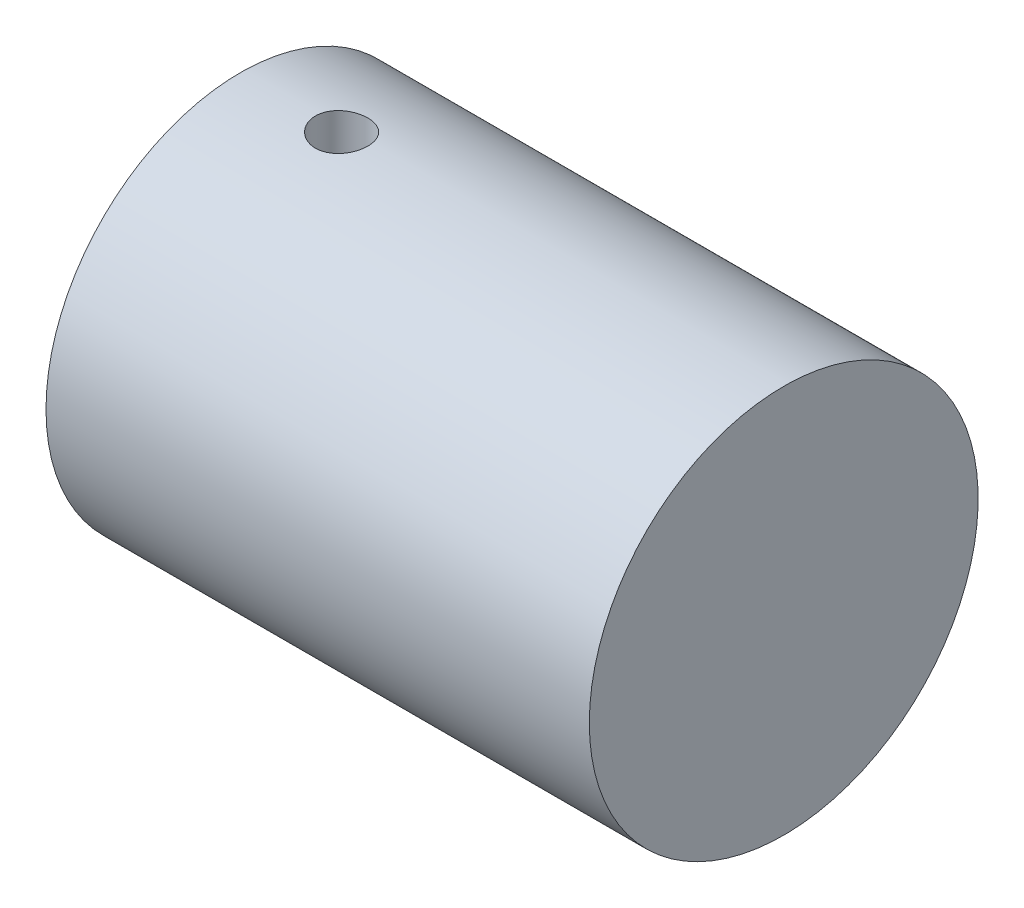
ISO-10303-21;
HEADER;
FILE_DESCRIPTION(('STEP AP214'),'2;1');
FILE_NAME('part.step','',(''),(''),'','','');
FILE_SCHEMA(('AUTOMOTIVE_DESIGN { 1 0 10303 214 1 1 1 1 }'));
ENDSEC;
DATA;
#1=APPLICATION_CONTEXT('core data for automotive mechanical design processes');
#2=APPLICATION_PROTOCOL_DEFINITION('international standard','automotive_design',2000,#1);
#3=PRODUCT_CONTEXT('',#1,'mechanical');
#4=PRODUCT('Part','Part','',(#3));
#5=PRODUCT_RELATED_PRODUCT_CATEGORY('part','',(#4));
#6=PRODUCT_DEFINITION_FORMATION('','',#4);
#7=PRODUCT_DEFINITION_CONTEXT('part definition',#1,'design');
#8=PRODUCT_DEFINITION('design','',#6,#7);
#9=PRODUCT_DEFINITION_SHAPE('','',#8);
#10=(LENGTH_UNIT() NAMED_UNIT(*) SI_UNIT(.MILLI.,.METRE.));
#11=(NAMED_UNIT(*) PLANE_ANGLE_UNIT() SI_UNIT($,.RADIAN.));
#12=(NAMED_UNIT(*) SI_UNIT($,.STERADIAN.) SOLID_ANGLE_UNIT());
#13=UNCERTAINTY_MEASURE_WITH_UNIT(LENGTH_MEASURE(1.E-05),#10,'distance_accuracy_value','');
#14=(GEOMETRIC_REPRESENTATION_CONTEXT(3) GLOBAL_UNCERTAINTY_ASSIGNED_CONTEXT((#13)) GLOBAL_UNIT_ASSIGNED_CONTEXT((#10,
#11,#12)) REPRESENTATION_CONTEXT('',''));
#15=CARTESIAN_POINT('',(0.,0.,0.));
#16=DIRECTION('',(0.,0.,1.));
#17=DIRECTION('',(1.,0.,0.));
#18=AXIS2_PLACEMENT_3D('',#15,#16,#17);
#19=CARTESIAN_POINT('',(-22.887888845137,18.25,0.));
#20=DIRECTION('',(1.,0.,0.));
#21=DIRECTION('',(0.,0.,-1.));
#22=AXIS2_PLACEMENT_3D('',#19,#20,#21);
#23=PLANE('',#22);
#24=CARTESIAN_POINT('',(-22.887888845137,0.,0.));
#25=DIRECTION('',(-1.,0.,0.));
#26=DIRECTION('',(0.,0.,1.));
#27=AXIS2_PLACEMENT_3D('',#24,#25,#26);
#28=CIRCLE('',#27,18.25);
#29=CARTESIAN_POINT('',(-22.887888845137,0.,18.25));
#30=VERTEX_POINT('',#29);
#31=EDGE_CURVE('E51',#30,#30,#28,.T.);
#32=ORIENTED_EDGE('',*,*,#31,.T.);
#33=EDGE_LOOP('',(#32));
#34=FACE_BOUND('',#33,.T.);
#35=ADVANCED_FACE('F35',(#34),#23,.F.);
#36=CARTESIAN_POINT('',(28.112111154863,0.,0.));
#37=DIRECTION('',(-1.,0.,0.));
#38=DIRECTION('',(0.,0.,1.));
#39=AXIS2_PLACEMENT_3D('',#36,#37,#38);
#40=PLANE('',#39);
#41=CARTESIAN_POINT('',(28.112111154863,0.,0.));
#42=DIRECTION('',(-1.,0.,0.));
#43=DIRECTION('',(0.,0.,1.));
#44=AXIS2_PLACEMENT_3D('',#41,#42,#43);
#45=CIRCLE('',#44,18.25);
#46=CARTESIAN_POINT('',(28.112111154863,0.,18.25));
#47=VERTEX_POINT('',#46);
#48=EDGE_CURVE('E47',#47,#47,#45,.T.);
#49=ORIENTED_EDGE('',*,*,#48,.F.);
#50=EDGE_LOOP('',(#49));
#51=FACE_BOUND('',#50,.T.);
#52=ADVANCED_FACE('F67',(#51),#40,.F.);
#53=CARTESIAN_POINT('',(-22.887888845137,0.,0.));
#54=DIRECTION('',(-1.,0.,0.));
#55=DIRECTION('',(0.,0.,1.));
#56=AXIS2_PLACEMENT_3D('',#53,#54,#55);
#57=CYLINDRICAL_SURFACE('',#56,18.25);
#58=CARTESIAN_POINT('',(-13.387888845137,18.0835787110848,2.459));
#59=CARTESIAN_POINT('',(-13.5253376475242,18.0835808169241,2.45899421348574));
#60=CARTESIAN_POINT('',(-13.6628701082442,18.085162715865,2.44743677926346));
#61=CARTESIAN_POINT('',(-13.9341009699168,18.0913163068287,2.40151831208515));
#62=CARTESIAN_POINT('',(-14.0677953176252,18.0958910463694,2.36713403472503));
#63=CARTESIAN_POINT('',(-14.3273840752238,18.1075029640547,2.2765996079461));
#64=CARTESIAN_POINT('',(-14.4532839597858,18.114538390228,2.22046494141464));
#65=CARTESIAN_POINT('',(-14.6938556239181,18.1302768698834,2.08805763245048));
#66=CARTESIAN_POINT('',(-14.8085291807393,18.1389796587566,2.01178818466488));
#67=CARTESIAN_POINT('',(-15.024157755453,18.1571354160075,1.84074740631306));
#68=CARTESIAN_POINT('',(-15.1250294540067,18.1665924380992,1.74587145440502));
#69=CARTESIAN_POINT('',(-15.3094703434391,18.1851547478193,1.54053639347486));
#70=CARTESIAN_POINT('',(-15.3930386409608,18.1942600172673,1.43007648036341));
#71=CARTESIAN_POINT('',(-15.5408028313193,18.2111347778014,1.19618128592544));
#72=CARTESIAN_POINT('',(-15.6049227886251,18.218898983235,1.07269761822786));
#73=CARTESIAN_POINT('',(-15.7114834639877,18.2321721086624,0.816592263991169));
#74=CARTESIAN_POINT('',(-15.7539251116666,18.2376811253624,0.683970969573949));
#75=CARTESIAN_POINT('',(-15.8156740060605,18.2457945855579,0.414209722811278));
#76=CARTESIAN_POINT('',(-15.8351202120306,18.2484164690277,0.277102111476703));
#77=CARTESIAN_POINT('',(-15.8507571755702,18.2505198858595,0.00154634529129973));
#78=CARTESIAN_POINT('',(-15.8469489874635,18.2500015615943,-0.136901748499662));
#79=CARTESIAN_POINT('',(-15.8162959977652,18.2458970088482,-0.410262046535406));
#80=CARTESIAN_POINT('',(-15.789600660911,18.2423306858238,-0.545191351933642));
#81=CARTESIAN_POINT('',(-15.7141651570175,18.2325531075199,-0.808637390859665));
#82=CARTESIAN_POINT('',(-15.6654245145829,18.226341795203,-0.937153986034425));
#83=CARTESIAN_POINT('',(-15.5471252185599,18.2119378325264,-1.18458540055389));
#84=CARTESIAN_POINT('',(-15.4775025335709,18.2037391031221,-1.30346923761383));
#85=CARTESIAN_POINT('',(-15.3194621226656,18.1862762942932,-1.52792253764446));
#86=CARTESIAN_POINT('',(-15.2310433960618,18.1770121581592,-1.63349129125289));
#87=CARTESIAN_POINT('',(-15.0370852865883,18.1583671741659,-1.82919692950846));
#88=CARTESIAN_POINT('',(-14.9314155513945,18.148985983638,-1.91920464214765));
#89=CARTESIAN_POINT('',(-14.7064009652847,18.1312364834247,-2.08022753706857));
#90=CARTESIAN_POINT('',(-14.5870560580073,18.1228681779141,-2.15124264106945));
#91=CARTESIAN_POINT('',(-14.3379566178235,18.1080921604579,-2.2722755267405));
#92=CARTESIAN_POINT('',(-14.2081964674048,18.1016855156347,-2.32228188536337));
#93=CARTESIAN_POINT('',(-13.9420146236764,18.0915782665476,-2.39975759213206));
#94=CARTESIAN_POINT('',(-13.8055933059581,18.0878775098993,-2.42722820940894));
#95=CARTESIAN_POINT('',(-13.531105565064,18.0836293339181,-2.45867934165332));
#96=CARTESIAN_POINT('',(-13.3930603915391,18.0830574470503,-2.46284212818653));
#97=CARTESIAN_POINT('',(-13.1182417517263,18.0850669632155,-2.44804136514473));
#98=CARTESIAN_POINT('',(-12.9814682539015,18.0876482878388,-2.42907839062919));
#99=CARTESIAN_POINT('',(-12.7136284661871,18.0956509976722,-2.36871828325306));
#100=CARTESIAN_POINT('',(-12.5825417083273,18.1010610881817,-2.32741034688528));
#101=CARTESIAN_POINT('',(-12.3291542616475,18.1141025409174,-2.22362506719413));
#102=CARTESIAN_POINT('',(-12.2068539286077,18.1217339930279,-2.16114686722846));
#103=CARTESIAN_POINT('',(-11.9736891215275,18.1384165594745,-2.01635021398588));
#104=CARTESIAN_POINT('',(-11.862899134888,18.147476068031,-1.93391279754334));
#105=CARTESIAN_POINT('',(-11.6566620564507,18.1659680249949,-1.75170494066658));
#106=CARTESIAN_POINT('',(-11.5612156607792,18.1754004902989,-1.65193371423835));
#107=CARTESIAN_POINT('',(-11.3877295779663,18.1936512158804,-1.43709173179503));
#108=CARTESIAN_POINT('',(-11.3098100422971,18.2024649675972,-1.3219235143952));
#109=CARTESIAN_POINT('',(-11.1744230018216,18.2184168374467,-1.08002747388945));
#110=CARTESIAN_POINT('',(-11.1169550287452,18.2255549939434,-0.953299915536033));
#111=CARTESIAN_POINT('',(-11.0242984711582,18.2373314871726,-0.692272846895262));
#112=CARTESIAN_POINT('',(-10.9890418345119,18.241977453034,-0.557997851563798));
#113=CARTESIAN_POINT('',(-10.9415877655168,18.248277903957,-0.285366828647599));
#114=CARTESIAN_POINT('',(-10.9293891161348,18.2499325469047,-0.147011016845642));
#115=CARTESIAN_POINT('',(-10.928422602408,18.250062867778,0.128683986017735));
#116=CARTESIAN_POINT('',(-10.9394700058668,18.2485636092166,0.266022553916011));
#117=CARTESIAN_POINT('',(-10.9842890124111,18.242604653723,0.536871465618862));
#118=CARTESIAN_POINT('',(-11.018060580693,18.2381449613248,0.670381815286304));
#119=CARTESIAN_POINT('',(-11.1073084088522,18.2267638836252,0.929750341457828));
#120=CARTESIAN_POINT('',(-11.1627743465944,18.2198436691771,1.05561212427817));
#121=CARTESIAN_POINT('',(-11.2938171850715,18.2043055327064,1.29627114819892));
#122=CARTESIAN_POINT('',(-11.3693944800683,18.1956875774021,1.4110681723264));
#123=CARTESIAN_POINT('',(-11.5391927199646,18.1776328398541,1.62728052347704));
#124=CARTESIAN_POINT('',(-11.6335507988471,18.1681903398642,1.72858768526939));
#125=CARTESIAN_POINT('',(-11.8379450433996,18.1495953104704,1.91400005819477));
#126=CARTESIAN_POINT('',(-11.9479849018321,18.1404428499875,1.99810120624356));
#127=CARTESIAN_POINT('',(-12.1811922528423,18.1234202954691,2.14704415220566));
#128=CARTESIAN_POINT('',(-12.304416470207,18.1155561437873,2.21179777994476));
#129=CARTESIAN_POINT('',(-12.5600318443233,18.1020701707047,2.3195975992742));
#130=CARTESIAN_POINT('',(-12.692413025161,18.0964459528293,2.36266700362567));
#131=CARTESIAN_POINT('',(-12.9191876545314,18.0894180640522,2.41576077001601));
#132=CARTESIAN_POINT('',(-13.0121609132014,18.0872394679388,2.43195162333737));
#133=CARTESIAN_POINT('',(-13.1993726178289,18.0843190759949,2.45357317229755));
#134=CARTESIAN_POINT('',(-13.2936110518902,18.0835772666642,2.45900396904));
#135=CARTESIAN_POINT('',(-13.387888845137,18.0835787110848,2.459));
#136=B_SPLINE_CURVE_WITH_KNOTS('',3,(#58,#59,#60,#61,#62,#63,#64,#65,#66,#67,#68,#69,#70,#71,
#72,#73,#74,#75,#76,#77,#78,#79,#80,#81,#82,#83,#84,#85,#86,#87,#88,#89,#90,#91,#92,#93,#94,#95,
#96,#97,#98,#99,#100,#101,#102,#103,#104,#105,#106,#107,#108,#109,#110,#111,#112,#113,#114,#115,
#116,#117,#118,#119,#120,#121,#122,#123,#124,#125,#126,#127,#128,#129,#130,#131,#132,#133,#134,
#135),.UNSPECIFIED.,.T.,.F.,(4,2,2,2,2,2,2,2,2,2,2,2,2,2,2,2,2,2,2,2,2,2,2,2,2,2,2,2,2,2,2,2,2,
2,2,2,2,2,4),(0.,0.412001929981193,0.824424043291159,1.23655311409598,1.64861683447799,
2.06306762712309,2.47753981211034,2.89361005656428,3.30966245735234,3.72318763218646,
4.13669405847094,4.54752046920672,4.95835573961663,5.37046387772926,5.78259396167418,
6.19799605818751,6.6133998668159,7.02902925080073,7.44463522644159,7.85698649800262,
8.26932751599086,8.68003457071013,9.09075824643455,9.50399298668632,9.91724646977936,
10.3332519823674,10.7492479692523,11.1639631289936,11.5786563988697,11.9900666265532,
12.4014762241336,12.8126903115515,13.2239124609779,13.6382553762629,14.0526960231867,
14.4689975128505,14.8848524029895,15.167452157048,15.4500492557305),.UNSPECIFIED.);
#137=CARTESIAN_POINT('',(-13.387888845137,18.0835787110848,2.459));
#138=VERTEX_POINT('',#137);
#139=EDGE_CURVE('E38',#138,#138,#136,.T.);
#140=ORIENTED_EDGE('',*,*,#139,.T.);
#141=EDGE_LOOP('',(#140));
#142=FACE_BOUND('',#141,.T.);
#143=CARTESIAN_POINT('',(-15.846888845137,-18.25,0.));
#144=CARTESIAN_POINT('',(-15.8468830641856,-18.2499979641082,0.137455187337311));
#145=CARTESIAN_POINT('',(-15.8353245924269,-18.2484307197795,0.274994014835482));
#146=CARTESIAN_POINT('',(-15.7894016298824,-18.2423294519504,0.54623810322385));
#147=CARTESIAN_POINT('',(-15.7550139173895,-18.237792407661,0.679939315910332));
#148=CARTESIAN_POINT('',(-15.6644694435668,-18.2262621987626,0.939542595752199));
#149=CARTESIAN_POINT('',(-15.6083280023898,-18.2192707629939,1.06545007946194));
#150=CARTESIAN_POINT('',(-15.4759047350709,-18.203607499004,1.30603449891701));
#151=CARTESIAN_POINT('',(-15.3996261199618,-18.1949359387507,1.4207132211846));
#152=CARTESIAN_POINT('',(-15.2285760424249,-18.1768175289345,1.63633605558593));
#153=CARTESIAN_POINT('',(-15.1337020102134,-18.167366555826,1.73719846270944));
#154=CARTESIAN_POINT('',(-14.9283747022637,-18.1487873881515,1.92162139303509));
#155=CARTESIAN_POINT('',(-14.8179205969499,-18.1396592108054,2.00518099434792));
#156=CARTESIAN_POINT('',(-14.5840305828737,-18.1227188574432,2.15293601755416));
#157=CARTESIAN_POINT('',(-14.460545288547,-18.1149120026633,2.21705392694257));
#158=CARTESIAN_POINT('',(-14.2044364019303,-18.1015534209274,2.32361036870908));
#159=CARTESIAN_POINT('',(-14.071813211723,-18.0960015948205,2.36604985428333));
#160=CARTESIAN_POINT('',(-13.8020457865264,-18.0878215553483,2.4277943391279));
#161=CARTESIAN_POINT('',(-13.6649338457665,-18.0851758165176,2.44723807190687));
#162=CARTESIAN_POINT('',(-13.3893695749456,-18.0830540631163,2.4628685886088));
#163=CARTESIAN_POINT('',(-13.2509173075391,-18.0835779010889,2.45905645445256));
#164=CARTESIAN_POINT('',(-12.9775742127217,-18.0877200773094,2.4283971430659));
#165=CARTESIAN_POINT('',(-12.8426658178735,-18.0913178021205,2.40170340561752));
#166=CARTESIAN_POINT('',(-12.5792607713697,-18.1011702144988,2.32627831984432));
#167=CARTESIAN_POINT('',(-12.4507642688179,-18.1074249638209,2.27754645930446));
#168=CARTESIAN_POINT('',(-12.2033574979801,-18.1219098297153,2.15926549739932));
#169=CARTESIAN_POINT('',(-12.0844791905648,-18.1301461976716,2.08965034072138));
#170=CARTESIAN_POINT('',(-11.8600337720379,-18.1476615636877,1.9316260787839));
#171=CARTESIAN_POINT('',(-11.754467368109,-18.1569406170897,1.84321597572963));
#172=CARTESIAN_POINT('',(-11.5587522674609,-18.1755872791721,1.64926407676928));
#173=CARTESIAN_POINT('',(-11.4687344754362,-18.1849549995901,1.54359014473026));
#174=CARTESIAN_POINT('',(-11.3076932302173,-18.2026538296124,1.31856353746765));
#175=CARTESIAN_POINT('',(-11.2366698337836,-18.2109849361189,1.19921082136964));
#176=CARTESIAN_POINT('',(-11.1156309439567,-18.2256782478296,0.950109072577216));
#177=CARTESIAN_POINT('',(-11.0656243475195,-18.2320396188944,0.820355664620348));
#178=CARTESIAN_POINT('',(-10.9881461078825,-18.2420693946272,0.554188504943003));
#179=CARTESIAN_POINT('',(-10.9606732376499,-18.2457379459266,0.417775116308217));
#180=CARTESIAN_POINT('',(-10.9292135878137,-18.2499495470076,0.143291367192005));
#181=CARTESIAN_POINT('',(-10.9250466150888,-18.2505165759303,0.00524201312414706));
#182=CARTESIAN_POINT('',(-10.9398404977052,-18.2485261822572,-0.269585986116865));
#183=CARTESIAN_POINT('',(-10.9588007787098,-18.2459688372513,-0.406364662760715));
#184=CARTESIAN_POINT('',(-11.01916119749,-18.2380319237991,-0.674231765520395));
#185=CARTESIAN_POINT('',(-11.0604747261072,-18.232663250599,-0.805340058285092));
#186=CARTESIAN_POINT('',(-11.1642783823827,-18.219704309668,-1.05876810814381));
#187=CARTESIAN_POINT('',(-11.2267693333637,-18.2121139555656,-1.18108752332518));
#188=CARTESIAN_POINT('',(-11.371585028888,-18.1954970852672,-1.41426582491176));
#189=CARTESIAN_POINT('',(-11.4540255046069,-18.1864622973874,-1.52505223646589));
#190=CARTESIAN_POINT('',(-11.6362373062888,-18.1679912941168,-1.73128068171609));
#191=CARTESIAN_POINT('',(-11.7360094364622,-18.1585550601137,-1.82672200298485));
#192=CARTESIAN_POINT('',(-11.9508493103242,-18.140269935232,-2.00019641482982));
#193=CARTESIAN_POINT('',(-12.0660143334472,-18.1314253662429,-2.07810955240548));
#194=CARTESIAN_POINT('',(-12.3079022117326,-18.1153981218945,-2.21348537719245));
#195=CARTESIAN_POINT('',(-12.4346248042044,-18.1082154087762,-2.27094852906345));
#196=CARTESIAN_POINT('',(-12.6956544374974,-18.0963553095106,-2.36360204595965));
#197=CARTESIAN_POINT('',(-12.8299377125752,-18.0916705098364,-2.39885837545688));
#198=CARTESIAN_POINT('',(-13.1025862547962,-18.085315999292,-2.44630902712711));
#199=CARTESIAN_POINT('',(-13.2409512981621,-18.083646123444,-2.45850461119671));
#200=CARTESIAN_POINT('',(-13.516641584892,-18.0835158538059,-2.45946189342311));
#201=CARTESIAN_POINT('',(-13.6539661993047,-18.0850296439264,-2.44841208637276));
#202=CARTESIAN_POINT('',(-13.9247865878155,-18.0910404168119,-2.40359316855525));
#203=CARTESIAN_POINT('',(-14.0582823636912,-18.095537398192,-2.36982406833599));
#204=CARTESIAN_POINT('',(-14.3176206301529,-18.1069994880461,-2.28058699047331));
#205=CARTESIAN_POINT('',(-14.4434668268645,-18.1139633899798,-2.22512961891815));
#206=CARTESIAN_POINT('',(-14.684098232427,-18.1295764461798,-2.09410875966218));
#207=CARTESIAN_POINT('',(-14.7988832146108,-18.1382256349702,-2.01854486005636));
#208=CARTESIAN_POINT('',(-15.0150954422698,-18.1563185845101,-1.84876169876144));
#209=CARTESIAN_POINT('',(-15.1164121160628,-18.1657679904603,-1.75440221761767));
#210=CARTESIAN_POINT('',(-15.3018430276917,-18.1843478001238,-1.55000120825191));
#211=CARTESIAN_POINT('',(-15.3859532278078,-18.1934781285455,-1.43995600943123));
#212=CARTESIAN_POINT('',(-15.5349063241762,-18.2104362129761,-1.20674397039978));
#213=CARTESIAN_POINT('',(-15.5996625724056,-18.2182580440711,-1.08352137754774));
#214=CARTESIAN_POINT('',(-15.7074677358471,-18.2316587271794,-0.827909373686088));
#215=CARTESIAN_POINT('',(-15.7505398335651,-18.2372399733009,-0.6955299252788));
#216=CARTESIAN_POINT('',(-15.8036408983945,-18.2442113225751,-0.468748152826025));
#217=CARTESIAN_POINT('',(-15.8198350341154,-18.246371292179,-0.375765508104039));
#218=CARTESIAN_POINT('',(-15.8414609413071,-18.2492663226762,-0.188535019525789));
#219=CARTESIAN_POINT('',(-15.8468928105722,-18.2500013965171,-0.0942871871738255));
#220=CARTESIAN_POINT('',(-15.846888845137,-18.25,0.));
#221=B_SPLINE_CURVE_WITH_KNOTS('',3,(#143,#144,#145,#146,#147,#148,#149,#150,#151,#152,#153,
#154,#155,#156,#157,#158,#159,#160,#161,#162,#163,#164,#165,#166,#167,#168,#169,#170,#171,#172,
#173,#174,#175,#176,#177,#178,#179,#180,#181,#182,#183,#184,#185,#186,#187,#188,#189,#190,#191,
#192,#193,#194,#195,#196,#197,#198,#199,#200,#201,#202,#203,#204,#205,#206,#207,#208,#209,#210,
#211,#212,#213,#214,#215,#216,#217,#218,#219,#220),.UNSPECIFIED.,.T.,.F.,(4,2,2,2,2,2,2,2,2,2,2,
2,2,2,2,2,2,2,2,2,2,2,2,2,2,2,2,2,2,2,2,2,2,2,2,2,2,2,4),(0.,0.412021112498522,
0.824461972792138,1.23661289629778,1.64869813870944,2.06312382288712,2.4775715818872,
2.89365061930214,3.30971136022636,3.72324898792429,4.13676737696921,4.54753428951863,
4.95831074969632,5.3704004756943,5.78251208436618,6.19794001619696,6.61336918942625,
7.02897404788411,7.4445562738379,7.85692087312012,8.26927523205012,8.68004321942498,
9.09082717821557,9.50405384780989,9.91729969676386,10.3332929140293,10.7492766785927,
11.1640188793317,11.5787383844938,11.9901079340896,12.4014772926988,12.8126457328075,
13.2238225968163,13.6381902902264,14.0526551090732,14.4689486173483,14.8847961164218,
15.1674239714827,15.4500492583581),.UNSPECIFIED.);
#222=CARTESIAN_POINT('',(-15.846888845137,-18.25,0.));
#223=VERTEX_POINT('',#222);
#224=EDGE_CURVE('E10',#223,#223,#221,.T.);
#225=ORIENTED_EDGE('',*,*,#224,.T.);
#226=EDGE_LOOP('',(#225));
#227=FACE_BOUND('',#226,.T.);
#228=ORIENTED_EDGE('',*,*,#31,.F.);
#229=EDGE_LOOP('',(#228));
#230=FACE_BOUND('',#229,.T.);
#231=ORIENTED_EDGE('',*,*,#48,.T.);
#232=EDGE_LOOP('',(#231));
#233=FACE_BOUND('',#232,.T.);
#234=ADVANCED_FACE('F57',(#142,#227,#230,#233),#57,.T.);
#235=CARTESIAN_POINT('',(-13.387888845137,-18.25,0.));
#236=DIRECTION('',(0.,1.,0.));
#237=DIRECTION('',(0.,0.,1.));
#238=AXIS2_PLACEMENT_3D('',#235,#236,#237);
#239=CYLINDRICAL_SURFACE('',#238,2.459);
#240=ORIENTED_EDGE('',*,*,#139,.F.);
#241=EDGE_LOOP('',(#240));
#242=FACE_BOUND('',#241,.T.);
#243=ORIENTED_EDGE('',*,*,#224,.F.);
#244=EDGE_LOOP('',(#243));
#245=FACE_BOUND('',#244,.T.);
#246=ADVANCED_FACE('F59',(#242,#245),#239,.F.);
#247=CLOSED_SHELL('',(#35,#52,#234,#246));
#248=MANIFOLD_SOLID_BREP('B2',#247);
#249=ADVANCED_BREP_SHAPE_REPRESENTATION('',(#18,#248),#14);
#250=SHAPE_DEFINITION_REPRESENTATION(#9,#249);
ENDSEC;
END-ISO-10303-21;
